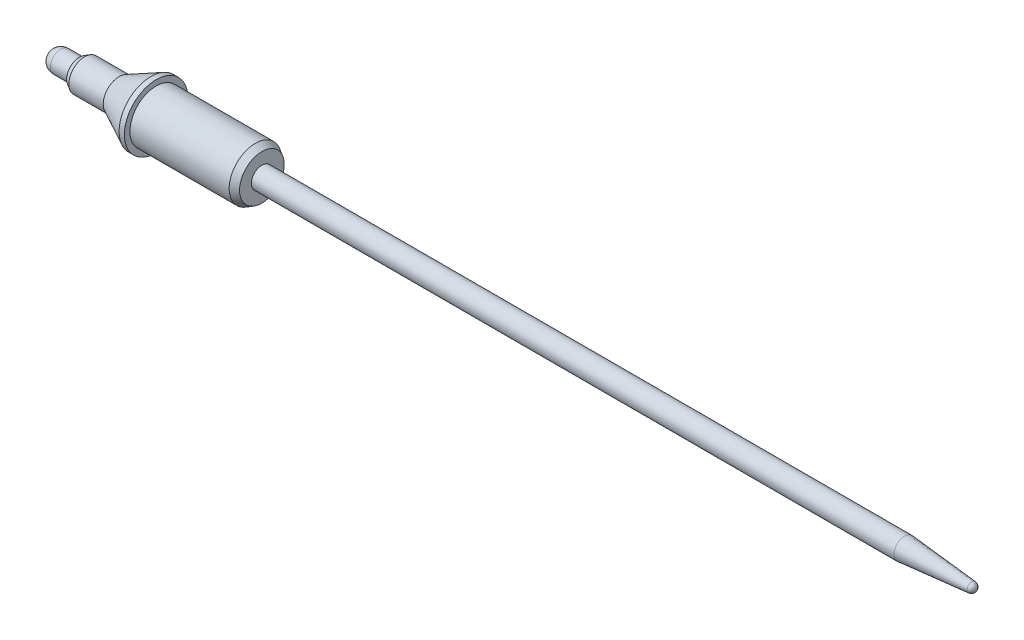
ISO-10303-21;
HEADER;
FILE_DESCRIPTION(('STEP AP214'),'2;1');
FILE_NAME('part.step','',(''),(''),'','','');
FILE_SCHEMA(('AUTOMOTIVE_DESIGN { 1 0 10303 214 1 1 1 1 }'));
ENDSEC;
DATA;
#1=APPLICATION_CONTEXT('core data for automotive mechanical design processes');
#2=APPLICATION_PROTOCOL_DEFINITION('international standard','automotive_design',2000,#1);
#3=PRODUCT_CONTEXT('',#1,'mechanical');
#4=PRODUCT('Part','Part','',(#3));
#5=PRODUCT_RELATED_PRODUCT_CATEGORY('part','',(#4));
#6=PRODUCT_DEFINITION_FORMATION('','',#4);
#7=PRODUCT_DEFINITION_CONTEXT('part definition',#1,'design');
#8=PRODUCT_DEFINITION('design','',#6,#7);
#9=PRODUCT_DEFINITION_SHAPE('','',#8);
#10=(LENGTH_UNIT() NAMED_UNIT(*) SI_UNIT(.MILLI.,.METRE.));
#11=(NAMED_UNIT(*) PLANE_ANGLE_UNIT() SI_UNIT($,.RADIAN.));
#12=(NAMED_UNIT(*) SI_UNIT($,.STERADIAN.) SOLID_ANGLE_UNIT());
#13=UNCERTAINTY_MEASURE_WITH_UNIT(LENGTH_MEASURE(1.E-05),#10,'distance_accuracy_value','');
#14=(GEOMETRIC_REPRESENTATION_CONTEXT(3) GLOBAL_UNCERTAINTY_ASSIGNED_CONTEXT((#13)) GLOBAL_UNIT_ASSIGNED_CONTEXT((#10,
#11,#12)) REPRESENTATION_CONTEXT('',''));
#15=CARTESIAN_POINT('',(0.,0.,0.));
#16=DIRECTION('',(0.,0.,1.));
#17=DIRECTION('',(1.,0.,0.));
#18=AXIS2_PLACEMENT_3D('',#15,#16,#17);
#19=CARTESIAN_POINT('',(3.4,0.,0.));
#20=DIRECTION('',(1.,0.,0.));
#21=DIRECTION('',(0.,0.,-1.));
#22=AXIS2_PLACEMENT_3D('',#19,#20,#21);
#23=CONICAL_SURFACE('',#22,1.2,0.463647609000806);
#24=CARTESIAN_POINT('',(2.2,0.,0.));
#25=DIRECTION('',(-1.,0.,0.));
#26=DIRECTION('',(0.,0.,1.));
#27=AXIS2_PLACEMENT_3D('',#24,#25,#26);
#28=CIRCLE('',#27,0.6);
#29=CARTESIAN_POINT('',(2.2,0.,0.6));
#30=VERTEX_POINT('',#29);
#31=EDGE_CURVE('E10',#30,#30,#28,.T.);
#32=ORIENTED_EDGE('',*,*,#31,.F.);
#33=EDGE_LOOP('',(#32));
#34=FACE_BOUND('',#33,.T.);
#35=CARTESIAN_POINT('',(3.4,0.,0.));
#36=DIRECTION('',(-1.,0.,0.));
#37=DIRECTION('',(0.,0.,1.));
#38=AXIS2_PLACEMENT_3D('',#35,#36,#37);
#39=CIRCLE('',#38,1.2);
#40=CARTESIAN_POINT('',(3.4,0.,1.2));
#41=VERTEX_POINT('',#40);
#42=EDGE_CURVE('E91',#41,#41,#39,.T.);
#43=ORIENTED_EDGE('',*,*,#42,.T.);
#44=EDGE_LOOP('',(#43));
#45=FACE_BOUND('',#44,.T.);
#46=ADVANCED_FACE('F34',(#34,#45),#23,.T.);
#47=CARTESIAN_POINT('',(-0.4,0.,0.));
#48=DIRECTION('',(-1.,0.,0.));
#49=DIRECTION('',(0.,0.,1.));
#50=AXIS2_PLACEMENT_3D('',#47,#48,#49);
#51=CYLINDRICAL_SURFACE('',#50,0.6);
#52=CARTESIAN_POINT('',(0.9,0.,0.));
#53=DIRECTION('',(-1.,0.,0.));
#54=DIRECTION('',(0.,0.,1.));
#55=AXIS2_PLACEMENT_3D('',#52,#53,#54);
#56=CIRCLE('',#55,0.6);
#57=CARTESIAN_POINT('',(0.9,0.,0.6));
#58=VERTEX_POINT('',#57);
#59=EDGE_CURVE('E41',#58,#58,#56,.T.);
#60=ORIENTED_EDGE('',*,*,#59,.F.);
#61=EDGE_LOOP('',(#60));
#62=FACE_BOUND('',#61,.T.);
#63=ORIENTED_EDGE('',*,*,#31,.T.);
#64=EDGE_LOOP('',(#63));
#65=FACE_BOUND('',#64,.T.);
#66=ADVANCED_FACE('F151',(#62,#65),#51,.T.);
#67=CARTESIAN_POINT('',(0.9,0.,0.));
#68=DIRECTION('',(1.,0.,0.));
#69=DIRECTION('',(0.,0.,-1.));
#70=AXIS2_PLACEMENT_3D('',#67,#68,#69);
#71=CONICAL_SURFACE('',#70,0.6,0.5235987755983);
#72=CARTESIAN_POINT('',(0.7,0.,0.));
#73=DIRECTION('',(-1.,0.,0.));
#74=DIRECTION('',(0.,0.,1.));
#75=AXIS2_PLACEMENT_3D('',#72,#73,#74);
#76=CIRCLE('',#75,0.484529946162074);
#77=CARTESIAN_POINT('',(0.7,0.,0.484529946162074));
#78=VERTEX_POINT('',#77);
#79=EDGE_CURVE('E47',#78,#78,#76,.T.);
#80=ORIENTED_EDGE('',*,*,#79,.F.);
#81=EDGE_LOOP('',(#80));
#82=FACE_BOUND('',#81,.T.);
#83=ORIENTED_EDGE('',*,*,#59,.T.);
#84=EDGE_LOOP('',(#83));
#85=FACE_BOUND('',#84,.T.);
#86=ADVANCED_FACE('F156',(#82,#85),#71,.T.);
#87=CARTESIAN_POINT('',(0.7,0.484529946162074,0.));
#88=DIRECTION('',(1.,0.,0.));
#89=DIRECTION('',(0.,0.,-1.));
#90=AXIS2_PLACEMENT_3D('',#87,#88,#89);
#91=PLANE('',#90);
#92=CARTESIAN_POINT('',(0.7,0.,0.));
#93=DIRECTION('',(-1.,0.,0.));
#94=DIRECTION('',(0.,0.,1.));
#95=AXIS2_PLACEMENT_3D('',#92,#93,#94);
#96=CIRCLE('',#95,0.4);
#97=CARTESIAN_POINT('',(0.7,0.,0.4));
#98=VERTEX_POINT('',#97);
#99=EDGE_CURVE('E53',#98,#98,#96,.T.);
#100=ORIENTED_EDGE('',*,*,#99,.F.);
#101=EDGE_LOOP('',(#100));
#102=FACE_BOUND('',#101,.T.);
#103=ORIENTED_EDGE('',*,*,#79,.T.);
#104=EDGE_LOOP('',(#103));
#105=FACE_BOUND('',#104,.T.);
#106=ADVANCED_FACE('F161',(#102,#105),#91,.F.);
#107=CARTESIAN_POINT('',(-0.4,0.,0.));
#108=DIRECTION('',(-1.,0.,0.));
#109=DIRECTION('',(0.,0.,1.));
#110=AXIS2_PLACEMENT_3D('',#107,#108,#109);
#111=CYLINDRICAL_SURFACE('',#110,0.4);
#112=CARTESIAN_POINT('',(0.,0.,0.));
#113=DIRECTION('',(-1.,0.,0.));
#114=DIRECTION('',(0.,0.,1.));
#115=AXIS2_PLACEMENT_3D('',#112,#113,#114);
#116=CIRCLE('',#115,0.4);
#117=CARTESIAN_POINT('',(0.,0.,0.4));
#118=VERTEX_POINT('',#117);
#119=EDGE_CURVE('E59',#118,#118,#116,.T.);
#120=ORIENTED_EDGE('',*,*,#119,.F.);
#121=EDGE_LOOP('',(#120));
#122=FACE_BOUND('',#121,.T.);
#123=ORIENTED_EDGE('',*,*,#99,.T.);
#124=EDGE_LOOP('',(#123));
#125=FACE_BOUND('',#124,.T.);
#126=ADVANCED_FACE('F147',(#122,#125),#111,.T.);
#127=CARTESIAN_POINT('',(0.,0.,0.));
#128=DIRECTION('',(-1.,0.,0.));
#129=DIRECTION('',(0.,1.,0.));
#130=AXIS2_PLACEMENT_3D('',#127,#128,#129);
#131=SPHERICAL_SURFACE('',#130,0.4);
#132=ORIENTED_EDGE('',*,*,#119,.T.);
#133=EDGE_LOOP('',(#132));
#134=FACE_BOUND('',#133,.T.);
#135=ADVANCED_FACE('F142',(#134),#131,.T.);
#136=CARTESIAN_POINT('',(34.4216849343458,0.,0.));
#137=DIRECTION('',(-1.,0.,0.));
#138=DIRECTION('',(0.,1.,0.));
#139=AXIS2_PLACEMENT_3D('',#136,#137,#138);
#140=SPHERICAL_SURFACE('',#139,0.178315065654223);
#141=CARTESIAN_POINT('',(34.437226116336,0.,0.));
#142=DIRECTION('',(-1.,0.,0.));
#143=DIRECTION('',(0.,0.,1.));
#144=AXIS2_PLACEMENT_3D('',#141,#142,#143);
#145=CIRCLE('',#144,0.177636522994619);
#146=CARTESIAN_POINT('',(34.437226116336,0.,0.177636522994619));
#147=VERTEX_POINT('',#146);
#148=EDGE_CURVE('E63',#147,#147,#145,.T.);
#149=ORIENTED_EDGE('',*,*,#148,.F.);
#150=EDGE_LOOP('',(#149));
#151=FACE_BOUND('',#150,.T.);
#152=ADVANCED_FACE('F137',(#151),#140,.T.);
#153=CARTESIAN_POINT('',(34.437226116336,0.,0.));
#154=DIRECTION('',(-1.,0.,0.));
#155=DIRECTION('',(0.,0.,1.));
#156=AXIS2_PLACEMENT_3D('',#153,#154,#155);
#157=CONICAL_SURFACE('',#156,0.177636522994619,0.0872664625997167);
#158=CARTESIAN_POINT('',(31.8955999439406,0.,0.));
#159=DIRECTION('',(-1.,0.,0.));
#160=DIRECTION('',(0.,0.,1.));
#161=AXIS2_PLACEMENT_3D('',#158,#159,#160);
#162=CIRCLE('',#161,0.4);
#163=CARTESIAN_POINT('',(31.8955999439406,0.,0.4));
#164=VERTEX_POINT('',#163);
#165=EDGE_CURVE('E67',#164,#164,#162,.T.);
#166=ORIENTED_EDGE('',*,*,#165,.F.);
#167=EDGE_LOOP('',(#166));
#168=FACE_BOUND('',#167,.T.);
#169=ORIENTED_EDGE('',*,*,#148,.T.);
#170=EDGE_LOOP('',(#169));
#171=FACE_BOUND('',#170,.T.);
#172=ADVANCED_FACE('F131',(#168,#171),#157,.T.);
#173=CARTESIAN_POINT('',(-0.4,0.,0.));
#174=DIRECTION('',(-1.,0.,0.));
#175=DIRECTION('',(0.,0.,1.));
#176=AXIS2_PLACEMENT_3D('',#173,#174,#175);
#177=CYLINDRICAL_SURFACE('',#176,0.4);
#178=CARTESIAN_POINT('',(7.6,0.,0.));
#179=DIRECTION('',(-1.,0.,0.));
#180=DIRECTION('',(0.,0.,1.));
#181=AXIS2_PLACEMENT_3D('',#178,#179,#180);
#182=CIRCLE('',#181,0.4);
#183=CARTESIAN_POINT('',(7.6,0.,0.4));
#184=VERTEX_POINT('',#183);
#185=EDGE_CURVE('E71',#184,#184,#182,.T.);
#186=ORIENTED_EDGE('',*,*,#185,.F.);
#187=EDGE_LOOP('',(#186));
#188=FACE_BOUND('',#187,.T.);
#189=ORIENTED_EDGE('',*,*,#165,.T.);
#190=EDGE_LOOP('',(#189));
#191=FACE_BOUND('',#190,.T.);
#192=ADVANCED_FACE('F125',(#188,#191),#177,.T.);
#193=CARTESIAN_POINT('',(7.6,0.845662432702593,0.));
#194=DIRECTION('',(-1.,0.,0.));
#195=DIRECTION('',(0.,0.,1.));
#196=AXIS2_PLACEMENT_3D('',#193,#194,#195);
#197=PLANE('',#196);
#198=CARTESIAN_POINT('',(7.6,0.,0.));
#199=DIRECTION('',(-1.,0.,0.));
#200=DIRECTION('',(0.,0.,1.));
#201=AXIS2_PLACEMENT_3D('',#198,#199,#200);
#202=CIRCLE('',#201,0.845662432702593);
#203=CARTESIAN_POINT('',(7.6,0.,0.845662432702593));
#204=VERTEX_POINT('',#203);
#205=EDGE_CURVE('E75',#204,#204,#202,.T.);
#206=ORIENTED_EDGE('',*,*,#205,.F.);
#207=EDGE_LOOP('',(#206));
#208=FACE_BOUND('',#207,.T.);
#209=ORIENTED_EDGE('',*,*,#185,.T.);
#210=EDGE_LOOP('',(#209));
#211=FACE_BOUND('',#210,.T.);
#212=ADVANCED_FACE('F119',(#208,#211),#197,.F.);
#213=CARTESIAN_POINT('',(7.6,0.,0.));
#214=DIRECTION('',(-1.,0.,0.));
#215=DIRECTION('',(0.,0.,1.));
#216=AXIS2_PLACEMENT_3D('',#213,#214,#215);
#217=CONICAL_SURFACE('',#216,0.845662432702593,0.5235987755983);
#218=CARTESIAN_POINT('',(7.35,0.,0.));
#219=DIRECTION('',(-1.,0.,0.));
#220=DIRECTION('',(0.,0.,1.));
#221=AXIS2_PLACEMENT_3D('',#218,#219,#220);
#222=CIRCLE('',#221,0.99);
#223=CARTESIAN_POINT('',(7.35,0.,0.99));
#224=VERTEX_POINT('',#223);
#225=EDGE_CURVE('E79',#224,#224,#222,.T.);
#226=ORIENTED_EDGE('',*,*,#225,.F.);
#227=EDGE_LOOP('',(#226));
#228=FACE_BOUND('',#227,.T.);
#229=ORIENTED_EDGE('',*,*,#205,.T.);
#230=EDGE_LOOP('',(#229));
#231=FACE_BOUND('',#230,.T.);
#232=ADVANCED_FACE('F113',(#228,#231),#217,.T.);
#233=CARTESIAN_POINT('',(-0.4,0.,0.));
#234=DIRECTION('',(-1.,0.,0.));
#235=DIRECTION('',(0.,0.,1.));
#236=AXIS2_PLACEMENT_3D('',#233,#234,#235);
#237=CYLINDRICAL_SURFACE('',#236,0.99);
#238=CARTESIAN_POINT('',(3.6,0.,0.));
#239=DIRECTION('',(-1.,0.,0.));
#240=DIRECTION('',(0.,0.,1.));
#241=AXIS2_PLACEMENT_3D('',#238,#239,#240);
#242=CIRCLE('',#241,0.99);
#243=CARTESIAN_POINT('',(3.6,0.,0.99));
#244=VERTEX_POINT('',#243);
#245=EDGE_CURVE('E83',#244,#244,#242,.T.);
#246=ORIENTED_EDGE('',*,*,#245,.F.);
#247=EDGE_LOOP('',(#246));
#248=FACE_BOUND('',#247,.T.);
#249=ORIENTED_EDGE('',*,*,#225,.T.);
#250=EDGE_LOOP('',(#249));
#251=FACE_BOUND('',#250,.T.);
#252=ADVANCED_FACE('F107',(#248,#251),#237,.T.);
#253=CARTESIAN_POINT('',(3.6,1.2,0.));
#254=DIRECTION('',(-1.,0.,0.));
#255=DIRECTION('',(0.,0.,1.));
#256=AXIS2_PLACEMENT_3D('',#253,#254,#255);
#257=PLANE('',#256);
#258=CARTESIAN_POINT('',(3.6,0.,0.));
#259=DIRECTION('',(-1.,0.,0.));
#260=DIRECTION('',(0.,0.,1.));
#261=AXIS2_PLACEMENT_3D('',#258,#259,#260);
#262=CIRCLE('',#261,1.2);
#263=CARTESIAN_POINT('',(3.6,0.,1.2));
#264=VERTEX_POINT('',#263);
#265=EDGE_CURVE('E87',#264,#264,#262,.T.);
#266=ORIENTED_EDGE('',*,*,#265,.F.);
#267=EDGE_LOOP('',(#266));
#268=FACE_BOUND('',#267,.T.);
#269=ORIENTED_EDGE('',*,*,#245,.T.);
#270=EDGE_LOOP('',(#269));
#271=FACE_BOUND('',#270,.T.);
#272=ADVANCED_FACE('F101',(#268,#271),#257,.F.);
#273=CARTESIAN_POINT('',(-0.4,0.,0.));
#274=DIRECTION('',(-1.,0.,0.));
#275=DIRECTION('',(0.,0.,1.));
#276=AXIS2_PLACEMENT_3D('',#273,#274,#275);
#277=CYLINDRICAL_SURFACE('',#276,1.2);
#278=ORIENTED_EDGE('',*,*,#42,.F.);
#279=EDGE_LOOP('',(#278));
#280=FACE_BOUND('',#279,.T.);
#281=ORIENTED_EDGE('',*,*,#265,.T.);
#282=EDGE_LOOP('',(#281));
#283=FACE_BOUND('',#282,.T.);
#284=ADVANCED_FACE('F98',(#280,#283),#277,.T.);
#285=CLOSED_SHELL('',(#46,#66,#86,#106,#126,#135,#152,#172,#192,#212,#232,#252,#272,#284));
#286=MANIFOLD_SOLID_BREP('B2',#285);
#287=ADVANCED_BREP_SHAPE_REPRESENTATION('',(#18,#286),#14);
#288=SHAPE_DEFINITION_REPRESENTATION(#9,#287);
ENDSEC;
END-ISO-10303-21;
